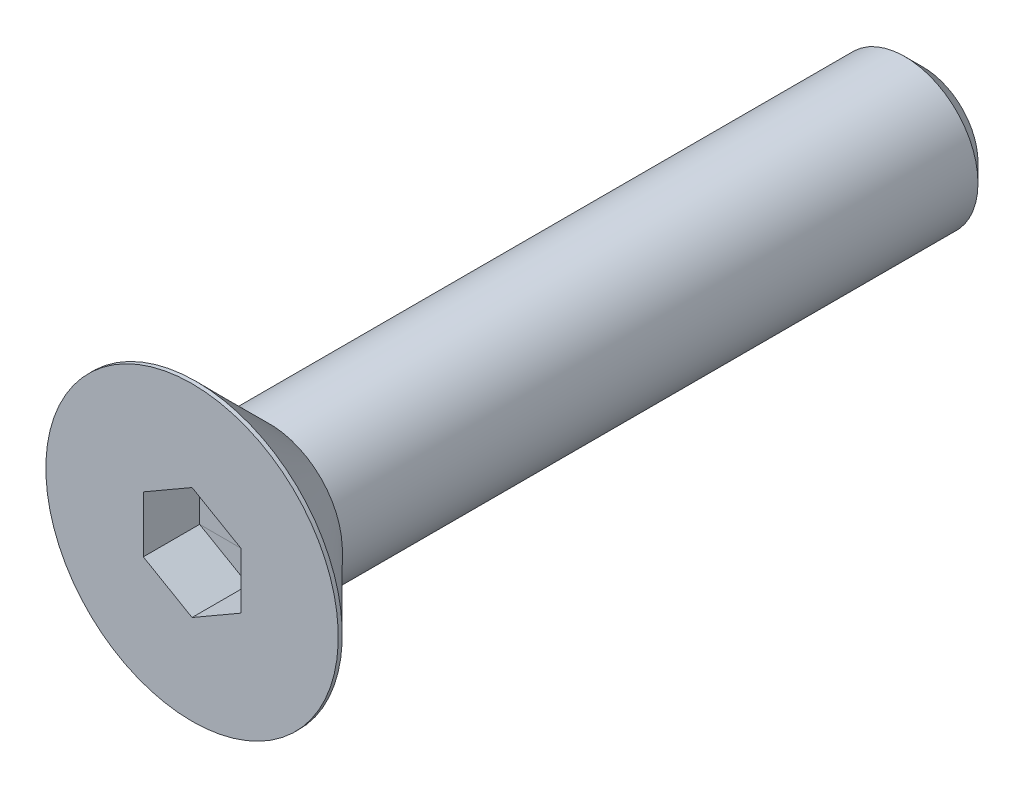
ISO-10303-21;
HEADER;
FILE_DESCRIPTION(('STEP AP214'),'2;1');
FILE_NAME('part.step','',(''),(''),'','','');
FILE_SCHEMA(('AUTOMOTIVE_DESIGN { 1 0 10303 214 1 1 1 1 }'));
ENDSEC;
DATA;
#1=APPLICATION_CONTEXT('core data for automotive mechanical design processes');
#2=APPLICATION_PROTOCOL_DEFINITION('international standard','automotive_design',2000,#1);
#3=PRODUCT_CONTEXT('',#1,'mechanical');
#4=PRODUCT('Part','Part','',(#3));
#5=PRODUCT_RELATED_PRODUCT_CATEGORY('part','',(#4));
#6=PRODUCT_DEFINITION_FORMATION('','',#4);
#7=PRODUCT_DEFINITION_CONTEXT('part definition',#1,'design');
#8=PRODUCT_DEFINITION('design','',#6,#7);
#9=PRODUCT_DEFINITION_SHAPE('','',#8);
#10=(LENGTH_UNIT() NAMED_UNIT(*) SI_UNIT(.MILLI.,.METRE.));
#11=(NAMED_UNIT(*) PLANE_ANGLE_UNIT() SI_UNIT($,.RADIAN.));
#12=(NAMED_UNIT(*) SI_UNIT($,.STERADIAN.) SOLID_ANGLE_UNIT());
#13=UNCERTAINTY_MEASURE_WITH_UNIT(LENGTH_MEASURE(1.E-05),#10,'distance_accuracy_value','');
#14=(GEOMETRIC_REPRESENTATION_CONTEXT(3) GLOBAL_UNCERTAINTY_ASSIGNED_CONTEXT((#13)) GLOBAL_UNIT_ASSIGNED_CONTEXT((#10,
#11,#12)) REPRESENTATION_CONTEXT('',''));
#15=CARTESIAN_POINT('',(0.,0.,0.));
#16=DIRECTION('',(0.,0.,1.));
#17=DIRECTION('',(1.,0.,0.));
#18=AXIS2_PLACEMENT_3D('',#15,#16,#17);
#19=CARTESIAN_POINT('',(0.,0.,14.835));
#20=DIRECTION('',(0.,0.,1.));
#21=DIRECTION('',(0.,-1.,0.));
#22=AXIS2_PLACEMENT_3D('',#19,#20,#21);
#23=CONICAL_SURFACE('',#22,6.,0.785398163397448);
#24=CARTESIAN_POINT('',(0.,0.,11.7));
#25=DIRECTION('',(0.,0.,1.));
#26=DIRECTION('',(0.,-1.,0.));
#27=AXIS2_PLACEMENT_3D('',#24,#25,#26);
#28=CIRCLE('',#27,2.865);
#29=CARTESIAN_POINT('',(0.,-2.865,11.7));
#30=VERTEX_POINT('',#29);
#31=EDGE_CURVE('E150',#30,#30,#28,.T.);
#32=ORIENTED_EDGE('',*,*,#31,.T.);
#33=EDGE_LOOP('',(#32));
#34=FACE_BOUND('',#33,.T.);
#35=CARTESIAN_POINT('',(0.,0.,14.835));
#36=DIRECTION('',(0.,0.,1.));
#37=DIRECTION('',(0.,-1.,0.));
#38=AXIS2_PLACEMENT_3D('',#35,#36,#37);
#39=CIRCLE('',#38,6.);
#40=CARTESIAN_POINT('',(0.,-6.,14.835));
#41=VERTEX_POINT('',#40);
#42=EDGE_CURVE('E12',#41,#41,#39,.T.);
#43=ORIENTED_EDGE('',*,*,#42,.F.);
#44=EDGE_LOOP('',(#43));
#45=FACE_BOUND('',#44,.T.);
#46=ADVANCED_FACE('F49',(#34,#45),#23,.T.);
#47=CARTESIAN_POINT('',(0.,0.,15.));
#48=DIRECTION('',(0.,0.,1.));
#49=DIRECTION('',(0.,-1.,0.));
#50=AXIS2_PLACEMENT_3D('',#47,#48,#49);
#51=CYLINDRICAL_SURFACE('',#50,6.);
#52=ORIENTED_EDGE('',*,*,#42,.T.);
#53=EDGE_LOOP('',(#52));
#54=FACE_BOUND('',#53,.T.);
#55=CARTESIAN_POINT('',(0.,0.,15.));
#56=DIRECTION('',(0.,0.,1.));
#57=DIRECTION('',(0.,-1.,0.));
#58=AXIS2_PLACEMENT_3D('',#55,#56,#57);
#59=CIRCLE('',#58,6.);
#60=CARTESIAN_POINT('',(0.,-6.,15.));
#61=VERTEX_POINT('',#60);
#62=EDGE_CURVE('E56',#61,#61,#59,.T.);
#63=ORIENTED_EDGE('',*,*,#62,.F.);
#64=EDGE_LOOP('',(#63));
#65=FACE_BOUND('',#64,.T.);
#66=ADVANCED_FACE('F162',(#54,#65),#51,.T.);
#67=CARTESIAN_POINT('',(0.,0.,15.));
#68=DIRECTION('',(0.,0.,-1.));
#69=DIRECTION('',(0.,1.,0.));
#70=AXIS2_PLACEMENT_3D('',#67,#68,#69);
#71=PLANE('',#70);
#72=DIRECTION('',(0.,1.,0.));
#73=VECTOR('',#72,1.);
#74=CARTESIAN_POINT('',(2.,-1.15470053837925,15.));
#75=LINE('',#74,#73);
#76=CARTESIAN_POINT('',(2.,-1.15470053837925,15.));
#77=VERTEX_POINT('',#76);
#78=CARTESIAN_POINT('',(2.,1.15470053837925,15.));
#79=VERTEX_POINT('',#78);
#80=EDGE_CURVE('E137',#77,#79,#75,.T.);
#81=ORIENTED_EDGE('',*,*,#80,.F.);
#82=DIRECTION('',(0.866025403784438,0.500000000000001,0.));
#83=VECTOR('',#82,1.);
#84=CARTESIAN_POINT('',(0.,-2.3094010767585,15.));
#85=LINE('',#84,#83);
#86=CARTESIAN_POINT('',(0.,-2.3094010767585,15.));
#87=VERTEX_POINT('',#86);
#88=EDGE_CURVE('E63',#87,#77,#85,.T.);
#89=ORIENTED_EDGE('',*,*,#88,.F.);
#90=DIRECTION('',(0.866025403784438,-0.5,0.));
#91=VECTOR('',#90,1.);
#92=CARTESIAN_POINT('',(-1.99999999999999,-1.15470053837925,15.));
#93=LINE('',#92,#91);
#94=CARTESIAN_POINT('',(-1.99999999999999,-1.15470053837925,15.));
#95=VERTEX_POINT('',#94);
#96=EDGE_CURVE('E146',#95,#87,#93,.T.);
#97=ORIENTED_EDGE('',*,*,#96,.F.);
#98=DIRECTION('',(0.,-1.,0.));
#99=VECTOR('',#98,1.);
#100=CARTESIAN_POINT('',(-1.99999999999999,1.15470053837925,15.));
#101=LINE('',#100,#99);
#102=CARTESIAN_POINT('',(-1.99999999999999,1.15470053837925,15.));
#103=VERTEX_POINT('',#102);
#104=EDGE_CURVE('E144',#103,#95,#101,.T.);
#105=ORIENTED_EDGE('',*,*,#104,.F.);
#106=DIRECTION('',(-0.866025403784439,-0.5,0.));
#107=VECTOR('',#106,1.);
#108=CARTESIAN_POINT('',(0.,2.3094010767585,15.));
#109=LINE('',#108,#107);
#110=CARTESIAN_POINT('',(0.,2.3094010767585,15.));
#111=VERTEX_POINT('',#110);
#112=EDGE_CURVE('E111',#111,#103,#109,.T.);
#113=ORIENTED_EDGE('',*,*,#112,.F.);
#114=DIRECTION('',(-0.866025403784439,0.5,0.));
#115=VECTOR('',#114,1.);
#116=CARTESIAN_POINT('',(2.,1.15470053837925,15.));
#117=LINE('',#116,#115);
#118=EDGE_CURVE('E140',#79,#111,#117,.T.);
#119=ORIENTED_EDGE('',*,*,#118,.F.);
#120=EDGE_LOOP('',(#81,#89,#97,#105,#113,#119));
#121=FACE_BOUND('',#120,.T.);
#122=ORIENTED_EDGE('',*,*,#62,.T.);
#123=EDGE_LOOP('',(#122));
#124=FACE_BOUND('',#123,.T.);
#125=ADVANCED_FACE('F160',(#121,#124),#71,.F.);
#126=CARTESIAN_POINT('',(0.,0.,11.7));
#127=DIRECTION('',(0.,0.,-1.));
#128=DIRECTION('',(0.,1.,0.));
#129=AXIS2_PLACEMENT_3D('',#126,#127,#128);
#130=PLANE('',#129);
#131=ORIENTED_EDGE('',*,*,#31,.F.);
#132=EDGE_LOOP('',(#131));
#133=FACE_BOUND('',#132,.T.);
#134=ADVANCED_FACE('F169',(#133),#130,.T.);
#135=CARTESIAN_POINT('',(0.,-2.3094010767585,12.69));
#136=DIRECTION('',(0.500000000000001,-0.866025403784438,0.));
#137=DIRECTION('',(0.866025403784438,0.500000000000001,0.));
#138=AXIS2_PLACEMENT_3D('',#135,#136,#137);
#139=PLANE('',#138);
#140=ORIENTED_EDGE('',*,*,#88,.T.);
#141=DIRECTION('',(0.,0.,1.));
#142=VECTOR('',#141,1.);
#143=CARTESIAN_POINT('',(2.,-1.15470053837925,12.69));
#144=LINE('',#143,#142);
#145=CARTESIAN_POINT('',(2.,-1.15470053837925,12.69));
#146=VERTEX_POINT('',#145);
#147=EDGE_CURVE('E93',#146,#77,#144,.T.);
#148=ORIENTED_EDGE('',*,*,#147,.F.);
#149=DIRECTION('',(0.866025403784438,0.500000000000001,0.));
#150=VECTOR('',#149,1.);
#151=CARTESIAN_POINT('',(0.,-2.3094010767585,12.69));
#152=LINE('',#151,#150);
#153=CARTESIAN_POINT('',(0.,-2.3094010767585,12.69));
#154=VERTEX_POINT('',#153);
#155=EDGE_CURVE('E148',#154,#146,#152,.T.);
#156=ORIENTED_EDGE('',*,*,#155,.F.);
#157=DIRECTION('',(0.,0.,1.));
#158=VECTOR('',#157,1.);
#159=CARTESIAN_POINT('',(0.,-2.3094010767585,12.69));
#160=LINE('',#159,#158);
#161=EDGE_CURVE('E71',#154,#87,#160,.T.);
#162=ORIENTED_EDGE('',*,*,#161,.T.);
#163=EDGE_LOOP('',(#140,#148,#156,#162));
#164=FACE_BOUND('',#163,.T.);
#165=ADVANCED_FACE('F176',(#164),#139,.F.);
#166=CARTESIAN_POINT('',(-1.99999999999999,-1.15470053837925,12.69));
#167=DIRECTION('',(-0.5,-0.866025403784439,0.));
#168=DIRECTION('',(0.866025403784439,-0.5,0.));
#169=AXIS2_PLACEMENT_3D('',#166,#167,#168);
#170=PLANE('',#169);
#171=ORIENTED_EDGE('',*,*,#96,.T.);
#172=ORIENTED_EDGE('',*,*,#161,.F.);
#173=DIRECTION('',(0.866025403784438,-0.5,0.));
#174=VECTOR('',#173,1.);
#175=CARTESIAN_POINT('',(-1.99999999999999,-1.15470053837925,12.69));
#176=LINE('',#175,#174);
#177=CARTESIAN_POINT('',(-1.99999999999999,-1.15470053837925,12.69));
#178=VERTEX_POINT('',#177);
#179=EDGE_CURVE('E123',#178,#154,#176,.T.);
#180=ORIENTED_EDGE('',*,*,#179,.F.);
#181=DIRECTION('',(0.,0.,1.));
#182=VECTOR('',#181,1.);
#183=CARTESIAN_POINT('',(-1.99999999999999,-1.15470053837925,12.69));
#184=LINE('',#183,#182);
#185=EDGE_CURVE('E115',#178,#95,#184,.T.);
#186=ORIENTED_EDGE('',*,*,#185,.T.);
#187=EDGE_LOOP('',(#171,#172,#180,#186));
#188=FACE_BOUND('',#187,.T.);
#189=ADVANCED_FACE('F180',(#188),#170,.F.);
#190=CARTESIAN_POINT('',(-1.99999999999999,1.15470053837925,12.69));
#191=DIRECTION('',(-1.,0.,0.));
#192=DIRECTION('',(0.,-1.,0.));
#193=AXIS2_PLACEMENT_3D('',#190,#191,#192);
#194=PLANE('',#193);
#195=ORIENTED_EDGE('',*,*,#104,.T.);
#196=ORIENTED_EDGE('',*,*,#185,.F.);
#197=DIRECTION('',(0.,-1.,0.));
#198=VECTOR('',#197,1.);
#199=CARTESIAN_POINT('',(-1.99999999999999,1.15470053837925,12.69));
#200=LINE('',#199,#198);
#201=CARTESIAN_POINT('',(-1.99999999999999,1.15470053837925,12.69));
#202=VERTEX_POINT('',#201);
#203=EDGE_CURVE('E119',#202,#178,#200,.T.);
#204=ORIENTED_EDGE('',*,*,#203,.F.);
#205=DIRECTION('',(0.,0.,1.));
#206=VECTOR('',#205,1.);
#207=CARTESIAN_POINT('',(-1.99999999999999,1.15470053837925,12.69));
#208=LINE('',#207,#206);
#209=EDGE_CURVE('E104',#202,#103,#208,.T.);
#210=ORIENTED_EDGE('',*,*,#209,.T.);
#211=EDGE_LOOP('',(#195,#196,#204,#210));
#212=FACE_BOUND('',#211,.T.);
#213=ADVANCED_FACE('F120',(#212),#194,.F.);
#214=CARTESIAN_POINT('',(0.,2.3094010767585,12.69));
#215=DIRECTION('',(-0.5,0.866025403784439,0.));
#216=DIRECTION('',(-0.866025403784439,-0.5,0.));
#217=AXIS2_PLACEMENT_3D('',#214,#215,#216);
#218=PLANE('',#217);
#219=ORIENTED_EDGE('',*,*,#112,.T.);
#220=ORIENTED_EDGE('',*,*,#209,.F.);
#221=DIRECTION('',(-0.866025403784439,-0.5,0.));
#222=VECTOR('',#221,1.);
#223=CARTESIAN_POINT('',(0.,2.3094010767585,12.69));
#224=LINE('',#223,#222);
#225=CARTESIAN_POINT('',(0.,2.3094010767585,12.69));
#226=VERTEX_POINT('',#225);
#227=EDGE_CURVE('E108',#226,#202,#224,.T.);
#228=ORIENTED_EDGE('',*,*,#227,.F.);
#229=DIRECTION('',(0.,0.,1.));
#230=VECTOR('',#229,1.);
#231=CARTESIAN_POINT('',(0.,2.3094010767585,12.69));
#232=LINE('',#231,#230);
#233=EDGE_CURVE('E116',#226,#111,#232,.T.);
#234=ORIENTED_EDGE('',*,*,#233,.T.);
#235=EDGE_LOOP('',(#219,#220,#228,#234));
#236=FACE_BOUND('',#235,.T.);
#237=ADVANCED_FACE('F106',(#236),#218,.F.);
#238=CARTESIAN_POINT('',(2.,1.15470053837925,12.69));
#239=DIRECTION('',(0.5,0.866025403784439,0.));
#240=DIRECTION('',(-0.866025403784439,0.5,0.));
#241=AXIS2_PLACEMENT_3D('',#238,#239,#240);
#242=PLANE('',#241);
#243=ORIENTED_EDGE('',*,*,#118,.T.);
#244=ORIENTED_EDGE('',*,*,#233,.F.);
#245=DIRECTION('',(-0.866025403784439,0.5,0.));
#246=VECTOR('',#245,1.);
#247=CARTESIAN_POINT('',(2.,1.15470053837925,12.69));
#248=LINE('',#247,#246);
#249=CARTESIAN_POINT('',(2.,1.15470053837925,12.69));
#250=VERTEX_POINT('',#249);
#251=EDGE_CURVE('E129',#250,#226,#248,.T.);
#252=ORIENTED_EDGE('',*,*,#251,.F.);
#253=DIRECTION('',(0.,0.,1.));
#254=VECTOR('',#253,1.);
#255=CARTESIAN_POINT('',(2.,1.15470053837925,12.69));
#256=LINE('',#255,#254);
#257=EDGE_CURVE('E153',#250,#79,#256,.T.);
#258=ORIENTED_EDGE('',*,*,#257,.T.);
#259=EDGE_LOOP('',(#243,#244,#252,#258));
#260=FACE_BOUND('',#259,.T.);
#261=ADVANCED_FACE('F184',(#260),#242,.F.);
#262=CARTESIAN_POINT('',(2.,-1.15470053837925,12.69));
#263=DIRECTION('',(1.,0.,0.));
#264=DIRECTION('',(0.,0.,-1.));
#265=AXIS2_PLACEMENT_3D('',#262,#263,#264);
#266=PLANE('',#265);
#267=ORIENTED_EDGE('',*,*,#80,.T.);
#268=ORIENTED_EDGE('',*,*,#257,.F.);
#269=DIRECTION('',(0.,1.,0.));
#270=VECTOR('',#269,1.);
#271=CARTESIAN_POINT('',(2.,-1.15470053837925,12.69));
#272=LINE('',#271,#270);
#273=EDGE_CURVE('E131',#146,#250,#272,.T.);
#274=ORIENTED_EDGE('',*,*,#273,.F.);
#275=ORIENTED_EDGE('',*,*,#147,.T.);
#276=EDGE_LOOP('',(#267,#268,#274,#275));
#277=FACE_BOUND('',#276,.T.);
#278=ADVANCED_FACE('F181',(#277),#266,.F.);
#279=CARTESIAN_POINT('',(2.,-1.15470053837924,12.69));
#280=DIRECTION('',(0.,0.,1.));
#281=DIRECTION('',(1.,0.,0.));
#282=AXIS2_PLACEMENT_3D('',#279,#280,#281);
#283=PLANE('',#282);
#284=ORIENTED_EDGE('',*,*,#155,.T.);
#285=ORIENTED_EDGE('',*,*,#273,.T.);
#286=ORIENTED_EDGE('',*,*,#251,.T.);
#287=ORIENTED_EDGE('',*,*,#227,.T.);
#288=ORIENTED_EDGE('',*,*,#203,.T.);
#289=ORIENTED_EDGE('',*,*,#179,.T.);
#290=EDGE_LOOP('',(#284,#285,#286,#287,#288,#289));
#291=FACE_BOUND('',#290,.T.);
#292=ADVANCED_FACE('F126',(#291),#283,.T.);
#293=CLOSED_SHELL('',(#46,#66,#125,#134,#165,#189,#213,#237,#261,#278,#292));
#294=MANIFOLD_SOLID_BREP('B2',#293);
#295=CARTESIAN_POINT('',(0.,-3.00000000000001,12.69));
#296=DIRECTION('',(0.,0.,-1.));
#297=DIRECTION('',(-1.,0.,0.));
#298=AXIS2_PLACEMENT_3D('',#295,#296,#297);
#299=PLANE('',#298);
#300=CARTESIAN_POINT('',(0.,0.,12.69));
#301=DIRECTION('',(0.,0.,1.));
#302=DIRECTION('',(1.,0.,0.));
#303=AXIS2_PLACEMENT_3D('',#300,#301,#302);
#304=CIRCLE('',#303,3.00000000000001);
#305=CARTESIAN_POINT('',(3.00000000000001,0.,12.69));
#306=VERTEX_POINT('',#305);
#307=EDGE_CURVE('E283',#306,#306,#304,.T.);
#308=ORIENTED_EDGE('',*,*,#307,.T.);
#309=EDGE_LOOP('',(#308));
#310=FACE_BOUND('',#309,.T.);
#311=ADVANCED_FACE('F270',(#310),#299,.F.);
#312=CARTESIAN_POINT('',(0.,-3.,-15.));
#313=DIRECTION('',(0.,0.,1.));
#314=DIRECTION('',(1.,0.,0.));
#315=AXIS2_PLACEMENT_3D('',#312,#313,#314);
#316=PLANE('',#315);
#317=CARTESIAN_POINT('',(0.,0.,-15.));
#318=DIRECTION('',(0.,0.,1.));
#319=DIRECTION('',(1.,0.,0.));
#320=AXIS2_PLACEMENT_3D('',#317,#318,#319);
#321=CIRCLE('',#320,2.25);
#322=CARTESIAN_POINT('',(2.25,0.,-15.));
#323=VERTEX_POINT('',#322);
#324=EDGE_CURVE('E48',#323,#323,#321,.F.);
#325=ORIENTED_EDGE('',*,*,#324,.T.);
#326=EDGE_LOOP('',(#325));
#327=FACE_BOUND('',#326,.T.);
#328=ADVANCED_FACE('F294',(#327),#316,.F.);
#329=CARTESIAN_POINT('',(0.,0.,12.69));
#330=DIRECTION('',(0.,0.,1.));
#331=DIRECTION('',(1.,0.,0.));
#332=AXIS2_PLACEMENT_3D('',#329,#330,#331);
#333=CYLINDRICAL_SURFACE('',#332,3.00000000000001);
#334=CARTESIAN_POINT('',(0.,0.,-14.25));
#335=DIRECTION('',(0.,0.,1.));
#336=DIRECTION('',(1.,0.,0.));
#337=AXIS2_PLACEMENT_3D('',#334,#335,#336);
#338=CIRCLE('',#337,3.00000000000001);
#339=CARTESIAN_POINT('',(3.00000000000001,0.,-14.25));
#340=VERTEX_POINT('',#339);
#341=EDGE_CURVE('E278',#340,#340,#338,.T.);
#342=ORIENTED_EDGE('',*,*,#341,.T.);
#343=EDGE_LOOP('',(#342));
#344=FACE_BOUND('',#343,.T.);
#345=ORIENTED_EDGE('',*,*,#307,.F.);
#346=EDGE_LOOP('',(#345));
#347=FACE_BOUND('',#346,.T.);
#348=ADVANCED_FACE('F292',(#344,#347),#333,.T.);
#349=CARTESIAN_POINT('',(0.,0.,-14.25));
#350=DIRECTION('',(0.,0.,1.));
#351=DIRECTION('',(1.,0.,0.));
#352=AXIS2_PLACEMENT_3D('',#349,#350,#351);
#353=CONICAL_SURFACE('',#352,3.00000000000001,0.785398163397451);
#354=ORIENTED_EDGE('',*,*,#324,.F.);
#355=EDGE_LOOP('',(#354));
#356=FACE_BOUND('',#355,.T.);
#357=ORIENTED_EDGE('',*,*,#341,.F.);
#358=EDGE_LOOP('',(#357));
#359=FACE_BOUND('',#358,.T.);
#360=ADVANCED_FACE('F272',(#356,#359),#353,.T.);
#361=CLOSED_SHELL('',(#311,#328,#348,#360));
#362=MANIFOLD_SOLID_BREP('B6',#361);
#363=ADVANCED_BREP_SHAPE_REPRESENTATION('',(#18,#294,#362),#14);
#364=SHAPE_DEFINITION_REPRESENTATION(#9,#363);
ENDSEC;
END-ISO-10303-21;
